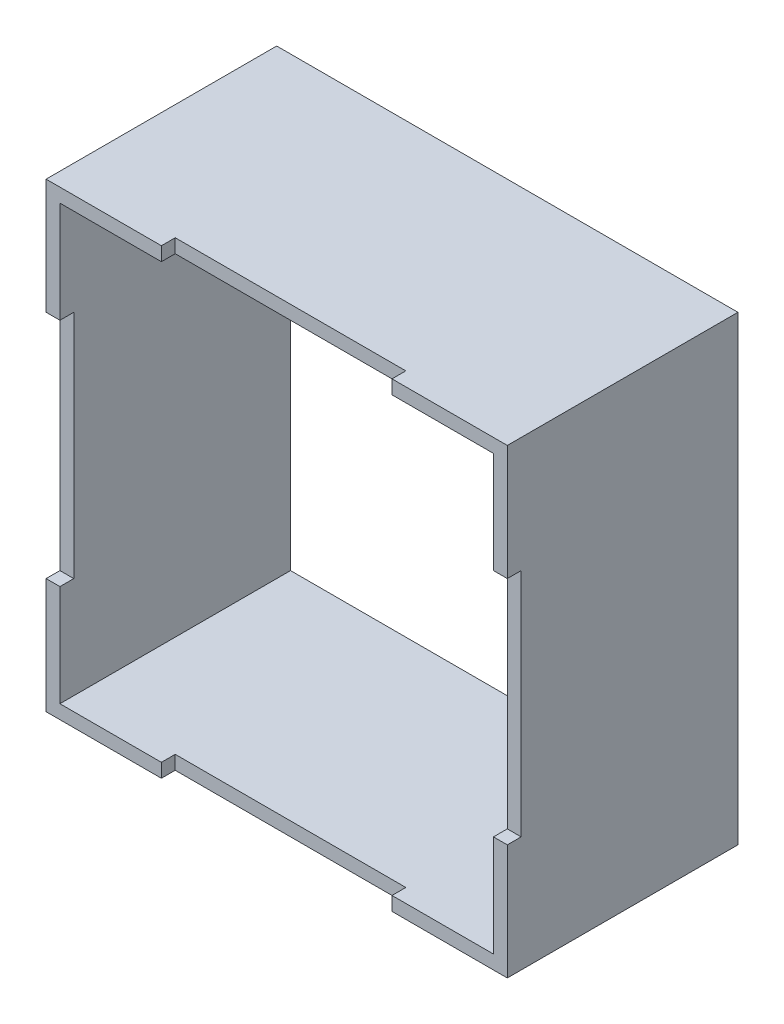
ISO-10303-21;
HEADER;
FILE_DESCRIPTION(('STEP AP214'),'2;1');
FILE_NAME('part.step','',(''),(''),'','','');
FILE_SCHEMA(('AUTOMOTIVE_DESIGN { 1 0 10303 214 1 1 1 1 }'));
ENDSEC;
DATA;
#1=APPLICATION_CONTEXT('core data for automotive mechanical design processes');
#2=APPLICATION_PROTOCOL_DEFINITION('international standard','automotive_design',2000,#1);
#3=PRODUCT_CONTEXT('',#1,'mechanical');
#4=PRODUCT('Part','Part','',(#3));
#5=PRODUCT_RELATED_PRODUCT_CATEGORY('part','',(#4));
#6=PRODUCT_DEFINITION_FORMATION('','',#4);
#7=PRODUCT_DEFINITION_CONTEXT('part definition',#1,'design');
#8=PRODUCT_DEFINITION('design','',#6,#7);
#9=PRODUCT_DEFINITION_SHAPE('','',#8);
#10=(LENGTH_UNIT() NAMED_UNIT(*) SI_UNIT(.MILLI.,.METRE.));
#11=(NAMED_UNIT(*) PLANE_ANGLE_UNIT() SI_UNIT($,.RADIAN.));
#12=(NAMED_UNIT(*) SI_UNIT($,.STERADIAN.) SOLID_ANGLE_UNIT());
#13=UNCERTAINTY_MEASURE_WITH_UNIT(LENGTH_MEASURE(1.E-05),#10,'distance_accuracy_value','');
#14=(GEOMETRIC_REPRESENTATION_CONTEXT(3) GLOBAL_UNCERTAINTY_ASSIGNED_CONTEXT((#13)) GLOBAL_UNIT_ASSIGNED_CONTEXT((#10,
#11,#12)) REPRESENTATION_CONTEXT('',''));
#15=CARTESIAN_POINT('',(0.,0.,0.));
#16=DIRECTION('',(0.,0.,1.));
#17=DIRECTION('',(1.,0.,0.));
#18=AXIS2_PLACEMENT_3D('',#15,#16,#17);
#19=CARTESIAN_POINT('',(0.,0.,50.));
#20=DIRECTION('',(0.,0.,1.));
#21=DIRECTION('',(1.,0.,0.));
#22=AXIS2_PLACEMENT_3D('',#19,#20,#21);
#23=PLANE('',#22);
#24=DIRECTION('',(0.,-1.,0.));
#25=VECTOR('',#24,1.);
#26=CARTESIAN_POINT('',(25.,0.,50.));
#27=LINE('',#26,#25);
#28=CARTESIAN_POINT('',(25.,0.,50.));
#29=VERTEX_POINT('',#28);
#30=CARTESIAN_POINT('',(25.,-3.,50.));
#31=VERTEX_POINT('',#30);
#32=EDGE_CURVE('E229',#29,#31,#27,.T.);
#33=ORIENTED_EDGE('',*,*,#32,.F.);
#34=DIRECTION('',(-1.,0.,0.));
#35=VECTOR('',#34,1.);
#36=CARTESIAN_POINT('',(0.,0.,50.));
#37=LINE('',#36,#35);
#38=CARTESIAN_POINT('',(0.,0.,50.));
#39=VERTEX_POINT('',#38);
#40=EDGE_CURVE('E218',#29,#39,#37,.T.);
#41=ORIENTED_EDGE('',*,*,#40,.T.);
#42=DIRECTION('',(0.,-1.,0.));
#43=VECTOR('',#42,1.);
#44=CARTESIAN_POINT('',(0.,0.,50.));
#45=LINE('',#44,#43);
#46=CARTESIAN_POINT('',(0.,-25.,50.));
#47=VERTEX_POINT('',#46);
#48=EDGE_CURVE('E320',#39,#47,#45,.T.);
#49=ORIENTED_EDGE('',*,*,#48,.T.);
#50=DIRECTION('',(-1.,0.,0.));
#51=VECTOR('',#50,1.);
#52=CARTESIAN_POINT('',(100.,-25.,50.));
#53=LINE('',#52,#51);
#54=CARTESIAN_POINT('',(3.,-25.,50.));
#55=VERTEX_POINT('',#54);
#56=EDGE_CURVE('E264',#55,#47,#53,.T.);
#57=ORIENTED_EDGE('',*,*,#56,.F.);
#58=DIRECTION('',(0.,-1.,0.));
#59=VECTOR('',#58,1.);
#60=CARTESIAN_POINT('',(3.,-3.,50.));
#61=LINE('',#60,#59);
#62=CARTESIAN_POINT('',(3.,-3.,50.));
#63=VERTEX_POINT('',#62);
#64=EDGE_CURVE('E282',#63,#55,#61,.T.);
#65=ORIENTED_EDGE('',*,*,#64,.F.);
#66=DIRECTION('',(-1.,0.,0.));
#67=VECTOR('',#66,1.);
#68=CARTESIAN_POINT('',(3.,-3.,50.));
#69=LINE('',#68,#67);
#70=EDGE_CURVE('E294',#31,#63,#69,.T.);
#71=ORIENTED_EDGE('',*,*,#70,.F.);
#72=EDGE_LOOP('',(#33,#41,#49,#57,#65,#71));
#73=FACE_BOUND('',#72,.T.);
#74=ADVANCED_FACE('F39',(#73),#23,.T.);
#75=CARTESIAN_POINT('',(25.,-97.,50.));
#76=VERTEX_POINT('',#75);
#77=CARTESIAN_POINT('',(25.,-100.,50.));
#78=VERTEX_POINT('',#77);
#79=EDGE_CURVE('E232',#76,#78,#27,.T.);
#80=ORIENTED_EDGE('',*,*,#79,.F.);
#81=DIRECTION('',(1.,0.,0.));
#82=VECTOR('',#81,1.);
#83=CARTESIAN_POINT('',(3.00000000000001,-97.,50.));
#84=LINE('',#83,#82);
#85=CARTESIAN_POINT('',(3.00000000000001,-97.,50.));
#86=VERTEX_POINT('',#85);
#87=EDGE_CURVE('E287',#86,#76,#84,.T.);
#88=ORIENTED_EDGE('',*,*,#87,.F.);
#89=CARTESIAN_POINT('',(3.,-75.,50.));
#90=VERTEX_POINT('',#89);
#91=EDGE_CURVE('E286',#90,#86,#61,.T.);
#92=ORIENTED_EDGE('',*,*,#91,.F.);
#93=DIRECTION('',(-1.,0.,0.));
#94=VECTOR('',#93,1.);
#95=CARTESIAN_POINT('',(100.,-75.,50.));
#96=LINE('',#95,#94);
#97=CARTESIAN_POINT('',(0.,-75.,50.));
#98=VERTEX_POINT('',#97);
#99=EDGE_CURVE('E268',#90,#98,#96,.T.);
#100=ORIENTED_EDGE('',*,*,#99,.T.);
#101=CARTESIAN_POINT('',(0.,-100.,50.));
#102=VERTEX_POINT('',#101);
#103=EDGE_CURVE('E324',#98,#102,#45,.T.);
#104=ORIENTED_EDGE('',*,*,#103,.T.);
#105=DIRECTION('',(1.,0.,0.));
#106=VECTOR('',#105,1.);
#107=CARTESIAN_POINT('',(0.,-100.,50.));
#108=LINE('',#107,#106);
#109=EDGE_CURVE('E325',#102,#78,#108,.T.);
#110=ORIENTED_EDGE('',*,*,#109,.T.);
#111=EDGE_LOOP('',(#80,#88,#92,#100,#104,#110));
#112=FACE_BOUND('',#111,.T.);
#113=ADVANCED_FACE('F440',(#112),#23,.T.);
#114=DIRECTION('',(0.,-1.,0.));
#115=VECTOR('',#114,1.);
#116=CARTESIAN_POINT('',(75.,0.,50.));
#117=LINE('',#116,#115);
#118=CARTESIAN_POINT('',(75.,0.,50.));
#119=VERTEX_POINT('',#118);
#120=CARTESIAN_POINT('',(75.,-3.,50.));
#121=VERTEX_POINT('',#120);
#122=EDGE_CURVE('E233',#119,#121,#117,.T.);
#123=ORIENTED_EDGE('',*,*,#122,.T.);
#124=CARTESIAN_POINT('',(97.,-3.,50.));
#125=VERTEX_POINT('',#124);
#126=EDGE_CURVE('E295',#125,#121,#69,.T.);
#127=ORIENTED_EDGE('',*,*,#126,.F.);
#128=DIRECTION('',(0.,1.,0.));
#129=VECTOR('',#128,1.);
#130=CARTESIAN_POINT('',(97.,-3.,50.));
#131=LINE('',#130,#129);
#132=CARTESIAN_POINT('',(97.,-25.,50.));
#133=VERTEX_POINT('',#132);
#134=EDGE_CURVE('E290',#133,#125,#131,.T.);
#135=ORIENTED_EDGE('',*,*,#134,.F.);
#136=CARTESIAN_POINT('',(100.,-25.,50.));
#137=VERTEX_POINT('',#136);
#138=EDGE_CURVE('E261',#137,#133,#53,.T.);
#139=ORIENTED_EDGE('',*,*,#138,.F.);
#140=DIRECTION('',(0.,1.,0.));
#141=VECTOR('',#140,1.);
#142=CARTESIAN_POINT('',(100.,0.,50.));
#143=LINE('',#142,#141);
#144=CARTESIAN_POINT('',(100.,0.,50.));
#145=VERTEX_POINT('',#144);
#146=EDGE_CURVE('E328',#137,#145,#143,.T.);
#147=ORIENTED_EDGE('',*,*,#146,.T.);
#148=EDGE_CURVE('E332',#145,#119,#37,.T.);
#149=ORIENTED_EDGE('',*,*,#148,.T.);
#150=EDGE_LOOP('',(#123,#127,#135,#139,#147,#149));
#151=FACE_BOUND('',#150,.T.);
#152=ADVANCED_FACE('F369',(#151),#23,.T.);
#153=CARTESIAN_POINT('',(75.,-97.,50.));
#154=VERTEX_POINT('',#153);
#155=CARTESIAN_POINT('',(75.,-100.,50.));
#156=VERTEX_POINT('',#155);
#157=EDGE_CURVE('E236',#154,#156,#117,.T.);
#158=ORIENTED_EDGE('',*,*,#157,.T.);
#159=CARTESIAN_POINT('',(100.,-100.,50.));
#160=VERTEX_POINT('',#159);
#161=EDGE_CURVE('E323',#156,#160,#108,.T.);
#162=ORIENTED_EDGE('',*,*,#161,.T.);
#163=CARTESIAN_POINT('',(100.,-75.,50.));
#164=VERTEX_POINT('',#163);
#165=EDGE_CURVE('E329',#160,#164,#143,.T.);
#166=ORIENTED_EDGE('',*,*,#165,.T.);
#167=CARTESIAN_POINT('',(97.,-75.,50.));
#168=VERTEX_POINT('',#167);
#169=EDGE_CURVE('E265',#164,#168,#96,.T.);
#170=ORIENTED_EDGE('',*,*,#169,.T.);
#171=CARTESIAN_POINT('',(97.,-97.,50.));
#172=VERTEX_POINT('',#171);
#173=EDGE_CURVE('E291',#172,#168,#131,.T.);
#174=ORIENTED_EDGE('',*,*,#173,.F.);
#175=EDGE_CURVE('E285',#154,#172,#84,.T.);
#176=ORIENTED_EDGE('',*,*,#175,.F.);
#177=EDGE_LOOP('',(#158,#162,#166,#170,#174,#176));
#178=FACE_BOUND('',#177,.T.);
#179=ADVANCED_FACE('F418',(#178),#23,.T.);
#180=CARTESIAN_POINT('',(0.,0.,0.));
#181=DIRECTION('',(0.,0.,1.));
#182=DIRECTION('',(1.,0.,0.));
#183=AXIS2_PLACEMENT_3D('',#180,#181,#182);
#184=PLANE('',#183);
#185=DIRECTION('',(0.,-1.,0.));
#186=VECTOR('',#185,1.);
#187=CARTESIAN_POINT('',(0.,0.,0.));
#188=LINE('',#187,#186);
#189=CARTESIAN_POINT('',(0.,0.,0.));
#190=VERTEX_POINT('',#189);
#191=CARTESIAN_POINT('',(0.,-100.,0.));
#192=VERTEX_POINT('',#191);
#193=EDGE_CURVE('E319',#190,#192,#188,.T.);
#194=ORIENTED_EDGE('',*,*,#193,.F.);
#195=DIRECTION('',(-1.,0.,0.));
#196=VECTOR('',#195,1.);
#197=CARTESIAN_POINT('',(0.,0.,0.));
#198=LINE('',#197,#196);
#199=CARTESIAN_POINT('',(100.,0.,0.));
#200=VERTEX_POINT('',#199);
#201=EDGE_CURVE('E342',#200,#190,#198,.T.);
#202=ORIENTED_EDGE('',*,*,#201,.F.);
#203=DIRECTION('',(0.,1.,0.));
#204=VECTOR('',#203,1.);
#205=CARTESIAN_POINT('',(100.,0.,0.));
#206=LINE('',#205,#204);
#207=CARTESIAN_POINT('',(100.,-100.,0.));
#208=VERTEX_POINT('',#207);
#209=EDGE_CURVE('E340',#208,#200,#206,.T.);
#210=ORIENTED_EDGE('',*,*,#209,.F.);
#211=DIRECTION('',(1.,0.,0.));
#212=VECTOR('',#211,1.);
#213=CARTESIAN_POINT('',(0.,-100.,0.));
#214=LINE('',#213,#212);
#215=EDGE_CURVE('E338',#192,#208,#214,.T.);
#216=ORIENTED_EDGE('',*,*,#215,.F.);
#217=EDGE_LOOP('',(#194,#202,#210,#216));
#218=FACE_BOUND('',#217,.T.);
#219=DIRECTION('',(0.,-1.,0.));
#220=VECTOR('',#219,1.);
#221=CARTESIAN_POINT('',(3.,-3.,0.));
#222=LINE('',#221,#220);
#223=CARTESIAN_POINT('',(3.,-3.,0.));
#224=VERTEX_POINT('',#223);
#225=CARTESIAN_POINT('',(3.00000000000001,-97.,0.));
#226=VERTEX_POINT('',#225);
#227=EDGE_CURVE('E281',#224,#226,#222,.T.);
#228=ORIENTED_EDGE('',*,*,#227,.T.);
#229=DIRECTION('',(1.,0.,0.));
#230=VECTOR('',#229,1.);
#231=CARTESIAN_POINT('',(3.00000000000001,-97.,0.));
#232=LINE('',#231,#230);
#233=CARTESIAN_POINT('',(97.,-97.,0.));
#234=VERTEX_POINT('',#233);
#235=EDGE_CURVE('E301',#226,#234,#232,.T.);
#236=ORIENTED_EDGE('',*,*,#235,.T.);
#237=DIRECTION('',(0.,1.,0.));
#238=VECTOR('',#237,1.);
#239=CARTESIAN_POINT('',(97.,-3.,0.));
#240=LINE('',#239,#238);
#241=CARTESIAN_POINT('',(97.,-3.,0.));
#242=VERTEX_POINT('',#241);
#243=EDGE_CURVE('E304',#234,#242,#240,.T.);
#244=ORIENTED_EDGE('',*,*,#243,.T.);
#245=DIRECTION('',(-1.,0.,0.));
#246=VECTOR('',#245,1.);
#247=CARTESIAN_POINT('',(3.,-3.,0.));
#248=LINE('',#247,#246);
#249=EDGE_CURVE('E307',#242,#224,#248,.T.);
#250=ORIENTED_EDGE('',*,*,#249,.T.);
#251=EDGE_LOOP('',(#228,#236,#244,#250));
#252=FACE_BOUND('',#251,.T.);
#253=ADVANCED_FACE('F391',(#218,#252),#184,.F.);
#254=CARTESIAN_POINT('',(0.,0.,50.));
#255=DIRECTION('',(1.,0.,0.));
#256=DIRECTION('',(0.,1.,0.));
#257=AXIS2_PLACEMENT_3D('',#254,#255,#256);
#258=PLANE('',#257);
#259=DIRECTION('',(0.,-1.,0.));
#260=VECTOR('',#259,1.);
#261=CARTESIAN_POINT('',(0.,-75.,47.));
#262=LINE('',#261,#260);
#263=CARTESIAN_POINT('',(0.,-25.,47.));
#264=VERTEX_POINT('',#263);
#265=CARTESIAN_POINT('',(0.,-75.,47.));
#266=VERTEX_POINT('',#265);
#267=EDGE_CURVE('E257',#264,#266,#262,.T.);
#268=ORIENTED_EDGE('',*,*,#267,.F.);
#269=DIRECTION('',(0.,0.,-1.));
#270=VECTOR('',#269,1.);
#271=CARTESIAN_POINT('',(0.,-25.,47.));
#272=LINE('',#271,#270);
#273=EDGE_CURVE('E243',#47,#264,#272,.T.);
#274=ORIENTED_EDGE('',*,*,#273,.F.);
#275=ORIENTED_EDGE('',*,*,#48,.F.);
#276=DIRECTION('',(0.,0.,-1.));
#277=VECTOR('',#276,1.);
#278=CARTESIAN_POINT('',(0.,0.,50.));
#279=LINE('',#278,#277);
#280=EDGE_CURVE('E335',#39,#190,#279,.T.);
#281=ORIENTED_EDGE('',*,*,#280,.T.);
#282=ORIENTED_EDGE('',*,*,#193,.T.);
#283=DIRECTION('',(0.,0.,-1.));
#284=VECTOR('',#283,1.);
#285=CARTESIAN_POINT('',(0.,-100.,50.));
#286=LINE('',#285,#284);
#287=EDGE_CURVE('E352',#102,#192,#286,.T.);
#288=ORIENTED_EDGE('',*,*,#287,.F.);
#289=ORIENTED_EDGE('',*,*,#103,.F.);
#290=DIRECTION('',(0.,0.,1.));
#291=VECTOR('',#290,1.);
#292=CARTESIAN_POINT('',(0.,-75.,50.));
#293=LINE('',#292,#291);
#294=EDGE_CURVE('E248',#266,#98,#293,.T.);
#295=ORIENTED_EDGE('',*,*,#294,.F.);
#296=EDGE_LOOP('',(#268,#274,#275,#281,#282,#288,#289,#295));
#297=FACE_BOUND('',#296,.T.);
#298=ADVANCED_FACE('F41',(#297),#258,.F.);
#299=CARTESIAN_POINT('',(0.,-100.,50.));
#300=DIRECTION('',(0.,1.,0.));
#301=DIRECTION('',(0.,0.,1.));
#302=AXIS2_PLACEMENT_3D('',#299,#300,#301);
#303=PLANE('',#302);
#304=DIRECTION('',(1.,0.,0.));
#305=VECTOR('',#304,1.);
#306=CARTESIAN_POINT('',(75.,-100.,47.));
#307=LINE('',#306,#305);
#308=CARTESIAN_POINT('',(25.,-100.,47.));
#309=VERTEX_POINT('',#308);
#310=CARTESIAN_POINT('',(75.,-100.,47.));
#311=VERTEX_POINT('',#310);
#312=EDGE_CURVE('E221',#309,#311,#307,.T.);
#313=ORIENTED_EDGE('',*,*,#312,.F.);
#314=DIRECTION('',(0.,0.,-1.));
#315=VECTOR('',#314,1.);
#316=CARTESIAN_POINT('',(25.,-100.,47.));
#317=LINE('',#316,#315);
#318=EDGE_CURVE('E225',#78,#309,#317,.T.);
#319=ORIENTED_EDGE('',*,*,#318,.F.);
#320=ORIENTED_EDGE('',*,*,#109,.F.);
#321=ORIENTED_EDGE('',*,*,#287,.T.);
#322=ORIENTED_EDGE('',*,*,#215,.T.);
#323=DIRECTION('',(0.,0.,-1.));
#324=VECTOR('',#323,1.);
#325=CARTESIAN_POINT('',(100.,-100.,50.));
#326=LINE('',#325,#324);
#327=EDGE_CURVE('E349',#160,#208,#326,.T.);
#328=ORIENTED_EDGE('',*,*,#327,.F.);
#329=ORIENTED_EDGE('',*,*,#161,.F.);
#330=DIRECTION('',(0.,0.,1.));
#331=VECTOR('',#330,1.);
#332=CARTESIAN_POINT('',(75.,-100.,50.));
#333=LINE('',#332,#331);
#334=EDGE_CURVE('E219',#311,#156,#333,.T.);
#335=ORIENTED_EDGE('',*,*,#334,.F.);
#336=EDGE_LOOP('',(#313,#319,#320,#321,#322,#328,#329,#335));
#337=FACE_BOUND('',#336,.T.);
#338=ADVANCED_FACE('F535',(#337),#303,.F.);
#339=CARTESIAN_POINT('',(100.,0.,50.));
#340=DIRECTION('',(-1.,0.,0.));
#341=DIRECTION('',(0.,-1.,0.));
#342=AXIS2_PLACEMENT_3D('',#339,#340,#341);
#343=PLANE('',#342);
#344=ORIENTED_EDGE('',*,*,#146,.F.);
#345=DIRECTION('',(0.,0.,-1.));
#346=VECTOR('',#345,1.);
#347=CARTESIAN_POINT('',(100.,-25.,47.));
#348=LINE('',#347,#346);
#349=CARTESIAN_POINT('',(100.,-25.,47.));
#350=VERTEX_POINT('',#349);
#351=EDGE_CURVE('E244',#137,#350,#348,.T.);
#352=ORIENTED_EDGE('',*,*,#351,.T.);
#353=DIRECTION('',(0.,-1.,0.));
#354=VECTOR('',#353,1.);
#355=CARTESIAN_POINT('',(100.,-75.,47.));
#356=LINE('',#355,#354);
#357=CARTESIAN_POINT('',(100.,-75.,47.));
#358=VERTEX_POINT('',#357);
#359=EDGE_CURVE('E247',#350,#358,#356,.T.);
#360=ORIENTED_EDGE('',*,*,#359,.T.);
#361=DIRECTION('',(0.,0.,1.));
#362=VECTOR('',#361,1.);
#363=CARTESIAN_POINT('',(100.,-75.,50.));
#364=LINE('',#363,#362);
#365=EDGE_CURVE('E251',#358,#164,#364,.T.);
#366=ORIENTED_EDGE('',*,*,#365,.T.);
#367=ORIENTED_EDGE('',*,*,#165,.F.);
#368=ORIENTED_EDGE('',*,*,#327,.T.);
#369=ORIENTED_EDGE('',*,*,#209,.T.);
#370=DIRECTION('',(0.,0.,-1.));
#371=VECTOR('',#370,1.);
#372=CARTESIAN_POINT('',(100.,0.,50.));
#373=LINE('',#372,#371);
#374=EDGE_CURVE('E346',#145,#200,#373,.T.);
#375=ORIENTED_EDGE('',*,*,#374,.F.);
#376=EDGE_LOOP('',(#344,#352,#360,#366,#367,#368,#369,#375));
#377=FACE_BOUND('',#376,.T.);
#378=ADVANCED_FACE('F386',(#377),#343,.F.);
#379=CARTESIAN_POINT('',(0.,0.,50.));
#380=DIRECTION('',(0.,-1.,0.));
#381=DIRECTION('',(0.,0.,-1.));
#382=AXIS2_PLACEMENT_3D('',#379,#380,#381);
#383=PLANE('',#382);
#384=ORIENTED_EDGE('',*,*,#40,.F.);
#385=DIRECTION('',(0.,0.,-1.));
#386=VECTOR('',#385,1.);
#387=CARTESIAN_POINT('',(25.,0.,47.));
#388=LINE('',#387,#386);
#389=CARTESIAN_POINT('',(25.,0.,47.));
#390=VERTEX_POINT('',#389);
#391=EDGE_CURVE('E199',#29,#390,#388,.T.);
#392=ORIENTED_EDGE('',*,*,#391,.T.);
#393=DIRECTION('',(1.,0.,0.));
#394=VECTOR('',#393,1.);
#395=CARTESIAN_POINT('',(75.,0.,47.));
#396=LINE('',#395,#394);
#397=CARTESIAN_POINT('',(75.,0.,47.));
#398=VERTEX_POINT('',#397);
#399=EDGE_CURVE('E206',#390,#398,#396,.T.);
#400=ORIENTED_EDGE('',*,*,#399,.T.);
#401=DIRECTION('',(0.,0.,1.));
#402=VECTOR('',#401,1.);
#403=CARTESIAN_POINT('',(75.,0.,50.));
#404=LINE('',#403,#402);
#405=EDGE_CURVE('E213',#398,#119,#404,.T.);
#406=ORIENTED_EDGE('',*,*,#405,.T.);
#407=ORIENTED_EDGE('',*,*,#148,.F.);
#408=ORIENTED_EDGE('',*,*,#374,.T.);
#409=ORIENTED_EDGE('',*,*,#201,.T.);
#410=ORIENTED_EDGE('',*,*,#280,.F.);
#411=EDGE_LOOP('',(#384,#392,#400,#406,#407,#408,#409,#410));
#412=FACE_BOUND('',#411,.T.);
#413=ADVANCED_FACE('F216',(#412),#383,.F.);
#414=CARTESIAN_POINT('',(3.,-3.,50.));
#415=DIRECTION('',(1.,0.,0.));
#416=DIRECTION('',(0.,1.,0.));
#417=AXIS2_PLACEMENT_3D('',#414,#415,#416);
#418=PLANE('',#417);
#419=DIRECTION('',(0.,0.,1.));
#420=VECTOR('',#419,1.);
#421=CARTESIAN_POINT('',(3.,-25.,50.));
#422=LINE('',#421,#420);
#423=CARTESIAN_POINT('',(3.,-25.,47.));
#424=VERTEX_POINT('',#423);
#425=EDGE_CURVE('E279',#424,#55,#422,.T.);
#426=ORIENTED_EDGE('',*,*,#425,.F.);
#427=DIRECTION('',(0.,1.,0.));
#428=VECTOR('',#427,1.);
#429=CARTESIAN_POINT('',(3.,-3.,47.));
#430=LINE('',#429,#428);
#431=CARTESIAN_POINT('',(3.00000000000001,-75.,47.));
#432=VERTEX_POINT('',#431);
#433=EDGE_CURVE('E263',#432,#424,#430,.T.);
#434=ORIENTED_EDGE('',*,*,#433,.F.);
#435=DIRECTION('',(0.,0.,-1.));
#436=VECTOR('',#435,1.);
#437=CARTESIAN_POINT('',(3.00000000000001,-75.,50.0000000000003));
#438=LINE('',#437,#436);
#439=EDGE_CURVE('E276',#90,#432,#438,.T.);
#440=ORIENTED_EDGE('',*,*,#439,.F.);
#441=ORIENTED_EDGE('',*,*,#91,.T.);
#442=DIRECTION('',(0.,0.,-1.));
#443=VECTOR('',#442,1.);
#444=CARTESIAN_POINT('',(3.00000000000001,-97.,50.));
#445=LINE('',#444,#443);
#446=EDGE_CURVE('E316',#86,#226,#445,.T.);
#447=ORIENTED_EDGE('',*,*,#446,.T.);
#448=ORIENTED_EDGE('',*,*,#227,.F.);
#449=DIRECTION('',(0.,0.,-1.));
#450=VECTOR('',#449,1.);
#451=CARTESIAN_POINT('',(3.,-3.,50.));
#452=LINE('',#451,#450);
#453=EDGE_CURVE('E298',#63,#224,#452,.T.);
#454=ORIENTED_EDGE('',*,*,#453,.F.);
#455=ORIENTED_EDGE('',*,*,#64,.T.);
#456=EDGE_LOOP('',(#426,#434,#440,#441,#447,#448,#454,#455));
#457=FACE_BOUND('',#456,.T.);
#458=ADVANCED_FACE('F406',(#457),#418,.T.);
#459=CARTESIAN_POINT('',(3.00000000000001,-97.,50.));
#460=DIRECTION('',(0.,1.,0.));
#461=DIRECTION('',(0.,0.,1.));
#462=AXIS2_PLACEMENT_3D('',#459,#460,#461);
#463=PLANE('',#462);
#464=DIRECTION('',(0.,0.,1.));
#465=VECTOR('',#464,1.);
#466=CARTESIAN_POINT('',(25.,-97.,50.));
#467=LINE('',#466,#465);
#468=CARTESIAN_POINT('',(25.,-97.,47.));
#469=VERTEX_POINT('',#468);
#470=EDGE_CURVE('E241',#469,#76,#467,.T.);
#471=ORIENTED_EDGE('',*,*,#470,.F.);
#472=DIRECTION('',(-1.,0.,0.));
#473=VECTOR('',#472,1.);
#474=CARTESIAN_POINT('',(3.00000000000001,-97.,47.));
#475=LINE('',#474,#473);
#476=CARTESIAN_POINT('',(75.,-97.,47.));
#477=VERTEX_POINT('',#476);
#478=EDGE_CURVE('E231',#477,#469,#475,.T.);
#479=ORIENTED_EDGE('',*,*,#478,.F.);
#480=DIRECTION('',(0.,0.,-1.));
#481=VECTOR('',#480,1.);
#482=CARTESIAN_POINT('',(75.,-97.,50.));
#483=LINE('',#482,#481);
#484=EDGE_CURVE('E239',#154,#477,#483,.T.);
#485=ORIENTED_EDGE('',*,*,#484,.F.);
#486=ORIENTED_EDGE('',*,*,#175,.T.);
#487=DIRECTION('',(0.,0.,-1.));
#488=VECTOR('',#487,1.);
#489=CARTESIAN_POINT('',(97.,-97.,50.));
#490=LINE('',#489,#488);
#491=EDGE_CURVE('E314',#172,#234,#490,.T.);
#492=ORIENTED_EDGE('',*,*,#491,.T.);
#493=ORIENTED_EDGE('',*,*,#235,.F.);
#494=ORIENTED_EDGE('',*,*,#446,.F.);
#495=ORIENTED_EDGE('',*,*,#87,.T.);
#496=EDGE_LOOP('',(#471,#479,#485,#486,#492,#493,#494,#495));
#497=FACE_BOUND('',#496,.T.);
#498=ADVANCED_FACE('F410',(#497),#463,.T.);
#499=CARTESIAN_POINT('',(97.,-3.,50.));
#500=DIRECTION('',(-1.,0.,0.));
#501=DIRECTION('',(0.,-1.,0.));
#502=AXIS2_PLACEMENT_3D('',#499,#500,#501);
#503=PLANE('',#502);
#504=DIRECTION('',(0.,0.,-1.));
#505=VECTOR('',#504,1.);
#506=CARTESIAN_POINT('',(97.,-25.,50.));
#507=LINE('',#506,#505);
#508=CARTESIAN_POINT('',(97.,-25.,47.));
#509=VERTEX_POINT('',#508);
#510=EDGE_CURVE('E359',#133,#509,#507,.T.);
#511=ORIENTED_EDGE('',*,*,#510,.F.);
#512=ORIENTED_EDGE('',*,*,#134,.T.);
#513=DIRECTION('',(0.,0.,-1.));
#514=VECTOR('',#513,1.);
#515=CARTESIAN_POINT('',(97.,-3.,50.));
#516=LINE('',#515,#514);
#517=EDGE_CURVE('E312',#125,#242,#516,.T.);
#518=ORIENTED_EDGE('',*,*,#517,.T.);
#519=ORIENTED_EDGE('',*,*,#243,.F.);
#520=ORIENTED_EDGE('',*,*,#491,.F.);
#521=ORIENTED_EDGE('',*,*,#173,.T.);
#522=DIRECTION('',(0.,0.,1.));
#523=VECTOR('',#522,1.);
#524=CARTESIAN_POINT('',(97.,-75.,50.0000000000003));
#525=LINE('',#524,#523);
#526=CARTESIAN_POINT('',(97.,-75.,47.));
#527=VERTEX_POINT('',#526);
#528=EDGE_CURVE('E357',#527,#168,#525,.T.);
#529=ORIENTED_EDGE('',*,*,#528,.F.);
#530=DIRECTION('',(0.,-1.,0.));
#531=VECTOR('',#530,1.);
#532=CARTESIAN_POINT('',(97.,-3.,47.));
#533=LINE('',#532,#531);
#534=EDGE_CURVE('E355',#509,#527,#533,.T.);
#535=ORIENTED_EDGE('',*,*,#534,.F.);
#536=EDGE_LOOP('',(#511,#512,#518,#519,#520,#521,#529,#535));
#537=FACE_BOUND('',#536,.T.);
#538=ADVANCED_FACE('F378',(#537),#503,.T.);
#539=CARTESIAN_POINT('',(3.,-3.,50.));
#540=DIRECTION('',(0.,-1.,0.));
#541=DIRECTION('',(0.,0.,-1.));
#542=AXIS2_PLACEMENT_3D('',#539,#540,#541);
#543=PLANE('',#542);
#544=DIRECTION('',(0.,0.,-1.));
#545=VECTOR('',#544,1.);
#546=CARTESIAN_POINT('',(25.,-3.,50.));
#547=LINE('',#546,#545);
#548=CARTESIAN_POINT('',(25.,-3.,47.));
#549=VERTEX_POINT('',#548);
#550=EDGE_CURVE('E11',#31,#549,#547,.T.);
#551=ORIENTED_EDGE('',*,*,#550,.F.);
#552=ORIENTED_EDGE('',*,*,#70,.T.);
#553=ORIENTED_EDGE('',*,*,#453,.T.);
#554=ORIENTED_EDGE('',*,*,#249,.F.);
#555=ORIENTED_EDGE('',*,*,#517,.F.);
#556=ORIENTED_EDGE('',*,*,#126,.T.);
#557=DIRECTION('',(0.,0.,1.));
#558=VECTOR('',#557,1.);
#559=CARTESIAN_POINT('',(75.,-3.,50.));
#560=LINE('',#559,#558);
#561=CARTESIAN_POINT('',(75.,-3.,47.));
#562=VERTEX_POINT('',#561);
#563=EDGE_CURVE('E47',#562,#121,#560,.T.);
#564=ORIENTED_EDGE('',*,*,#563,.F.);
#565=DIRECTION('',(1.,0.,0.));
#566=VECTOR('',#565,1.);
#567=CARTESIAN_POINT('',(3.,-3.,47.));
#568=LINE('',#567,#566);
#569=EDGE_CURVE('E362',#549,#562,#568,.T.);
#570=ORIENTED_EDGE('',*,*,#569,.F.);
#571=EDGE_LOOP('',(#551,#552,#553,#554,#555,#556,#564,#570));
#572=FACE_BOUND('',#571,.T.);
#573=ADVANCED_FACE('F373',(#572),#543,.T.);
#574=CARTESIAN_POINT('',(100.,-75.,47.));
#575=DIRECTION('',(0.,0.,-1.));
#576=DIRECTION('',(-1.,0.,0.));
#577=AXIS2_PLACEMENT_3D('',#574,#575,#576);
#578=PLANE('',#577);
#579=ORIENTED_EDGE('',*,*,#534,.T.);
#580=DIRECTION('',(-1.,0.,0.));
#581=VECTOR('',#580,1.);
#582=CARTESIAN_POINT('',(100.,-75.,47.));
#583=LINE('',#582,#581);
#584=EDGE_CURVE('E269',#358,#527,#583,.T.);
#585=ORIENTED_EDGE('',*,*,#584,.F.);
#586=ORIENTED_EDGE('',*,*,#359,.F.);
#587=DIRECTION('',(-1.,0.,0.));
#588=VECTOR('',#587,1.);
#589=CARTESIAN_POINT('',(100.,-25.,47.));
#590=LINE('',#589,#588);
#591=EDGE_CURVE('E273',#350,#509,#590,.T.);
#592=ORIENTED_EDGE('',*,*,#591,.T.);
#593=EDGE_LOOP('',(#579,#585,#586,#592));
#594=FACE_BOUND('',#593,.T.);
#595=ADVANCED_FACE('F425',(#594),#578,.F.);
#596=CARTESIAN_POINT('',(100.,-75.,50.));
#597=DIRECTION('',(0.,-1.,0.));
#598=DIRECTION('',(0.,0.,-1.));
#599=AXIS2_PLACEMENT_3D('',#596,#597,#598);
#600=PLANE('',#599);
#601=ORIENTED_EDGE('',*,*,#528,.T.);
#602=ORIENTED_EDGE('',*,*,#169,.F.);
#603=ORIENTED_EDGE('',*,*,#365,.F.);
#604=ORIENTED_EDGE('',*,*,#584,.T.);
#605=EDGE_LOOP('',(#601,#602,#603,#604));
#606=FACE_BOUND('',#605,.T.);
#607=ADVANCED_FACE('F422',(#606),#600,.F.);
#608=CARTESIAN_POINT('',(100.,-25.,47.));
#609=DIRECTION('',(0.,1.,0.));
#610=DIRECTION('',(-1.,0.,0.));
#611=AXIS2_PLACEMENT_3D('',#608,#609,#610);
#612=PLANE('',#611);
#613=ORIENTED_EDGE('',*,*,#510,.T.);
#614=ORIENTED_EDGE('',*,*,#591,.F.);
#615=ORIENTED_EDGE('',*,*,#351,.F.);
#616=ORIENTED_EDGE('',*,*,#138,.T.);
#617=EDGE_LOOP('',(#613,#614,#615,#616));
#618=FACE_BOUND('',#617,.T.);
#619=ADVANCED_FACE('F426',(#618),#612,.F.);
#620=ORIENTED_EDGE('',*,*,#425,.T.);
#621=ORIENTED_EDGE('',*,*,#56,.T.);
#622=ORIENTED_EDGE('',*,*,#273,.T.);
#623=EDGE_CURVE('E254',#424,#264,#590,.T.);
#624=ORIENTED_EDGE('',*,*,#623,.F.);
#625=EDGE_LOOP('',(#620,#621,#622,#624));
#626=FACE_BOUND('',#625,.T.);
#627=ADVANCED_FACE('F428',(#626),#612,.F.);
#628=ORIENTED_EDGE('',*,*,#439,.T.);
#629=EDGE_CURVE('E272',#432,#266,#583,.T.);
#630=ORIENTED_EDGE('',*,*,#629,.T.);
#631=ORIENTED_EDGE('',*,*,#294,.T.);
#632=ORIENTED_EDGE('',*,*,#99,.F.);
#633=EDGE_LOOP('',(#628,#630,#631,#632));
#634=FACE_BOUND('',#633,.T.);
#635=ADVANCED_FACE('F434',(#634),#600,.F.);
#636=ORIENTED_EDGE('',*,*,#433,.T.);
#637=ORIENTED_EDGE('',*,*,#623,.T.);
#638=ORIENTED_EDGE('',*,*,#267,.T.);
#639=ORIENTED_EDGE('',*,*,#629,.F.);
#640=EDGE_LOOP('',(#636,#637,#638,#639));
#641=FACE_BOUND('',#640,.T.);
#642=ADVANCED_FACE('F470',(#641),#578,.F.);
#643=CARTESIAN_POINT('',(75.,0.,47.));
#644=DIRECTION('',(0.,0.,-1.));
#645=DIRECTION('',(-1.,0.,0.));
#646=AXIS2_PLACEMENT_3D('',#643,#644,#645);
#647=PLANE('',#646);
#648=ORIENTED_EDGE('',*,*,#569,.T.);
#649=DIRECTION('',(0.,-1.,0.));
#650=VECTOR('',#649,1.);
#651=CARTESIAN_POINT('',(75.,0.,47.));
#652=LINE('',#651,#650);
#653=EDGE_CURVE('E209',#398,#562,#652,.T.);
#654=ORIENTED_EDGE('',*,*,#653,.F.);
#655=ORIENTED_EDGE('',*,*,#399,.F.);
#656=DIRECTION('',(0.,-1.,0.));
#657=VECTOR('',#656,1.);
#658=CARTESIAN_POINT('',(25.,0.,47.));
#659=LINE('',#658,#657);
#660=EDGE_CURVE('E62',#390,#549,#659,.T.);
#661=ORIENTED_EDGE('',*,*,#660,.T.);
#662=EDGE_LOOP('',(#648,#654,#655,#661));
#663=FACE_BOUND('',#662,.T.);
#664=ADVANCED_FACE('F207',(#663),#647,.F.);
#665=CARTESIAN_POINT('',(75.,0.,50.));
#666=DIRECTION('',(1.,0.,0.));
#667=DIRECTION('',(0.,0.,-1.));
#668=AXIS2_PLACEMENT_3D('',#665,#666,#667);
#669=PLANE('',#668);
#670=ORIENTED_EDGE('',*,*,#563,.T.);
#671=ORIENTED_EDGE('',*,*,#122,.F.);
#672=ORIENTED_EDGE('',*,*,#405,.F.);
#673=ORIENTED_EDGE('',*,*,#653,.T.);
#674=EDGE_LOOP('',(#670,#671,#672,#673));
#675=FACE_BOUND('',#674,.T.);
#676=ADVANCED_FACE('F365',(#675),#669,.F.);
#677=CARTESIAN_POINT('',(25.,0.,47.));
#678=DIRECTION('',(-1.,0.,0.));
#679=DIRECTION('',(0.,0.,1.));
#680=AXIS2_PLACEMENT_3D('',#677,#678,#679);
#681=PLANE('',#680);
#682=ORIENTED_EDGE('',*,*,#550,.T.);
#683=ORIENTED_EDGE('',*,*,#660,.F.);
#684=ORIENTED_EDGE('',*,*,#391,.F.);
#685=ORIENTED_EDGE('',*,*,#32,.T.);
#686=EDGE_LOOP('',(#682,#683,#684,#685));
#687=FACE_BOUND('',#686,.T.);
#688=ADVANCED_FACE('F197',(#687),#681,.F.);
#689=ORIENTED_EDGE('',*,*,#470,.T.);
#690=ORIENTED_EDGE('',*,*,#79,.T.);
#691=ORIENTED_EDGE('',*,*,#318,.T.);
#692=EDGE_CURVE('E203',#469,#309,#659,.T.);
#693=ORIENTED_EDGE('',*,*,#692,.F.);
#694=EDGE_LOOP('',(#689,#690,#691,#693));
#695=FACE_BOUND('',#694,.T.);
#696=ADVANCED_FACE('F602',(#695),#681,.F.);
#697=ORIENTED_EDGE('',*,*,#484,.T.);
#698=EDGE_CURVE('E54',#477,#311,#652,.T.);
#699=ORIENTED_EDGE('',*,*,#698,.T.);
#700=ORIENTED_EDGE('',*,*,#334,.T.);
#701=ORIENTED_EDGE('',*,*,#157,.F.);
#702=EDGE_LOOP('',(#697,#699,#700,#701));
#703=FACE_BOUND('',#702,.T.);
#704=ADVANCED_FACE('F594',(#703),#669,.F.);
#705=ORIENTED_EDGE('',*,*,#478,.T.);
#706=ORIENTED_EDGE('',*,*,#692,.T.);
#707=ORIENTED_EDGE('',*,*,#312,.T.);
#708=ORIENTED_EDGE('',*,*,#698,.F.);
#709=EDGE_LOOP('',(#705,#706,#707,#708));
#710=FACE_BOUND('',#709,.T.);
#711=ADVANCED_FACE('F585',(#710),#647,.F.);
#712=CLOSED_SHELL('',(#74,#113,#152,#179,#253,#298,#338,#378,#413,#458,#498,#538,#573,#595,#607,
#619,#627,#635,#642,#664,#676,#688,#696,#704,#711));
#713=MANIFOLD_SOLID_BREP('B2',#712);
#714=ADVANCED_BREP_SHAPE_REPRESENTATION('',(#18,#713),#14);
#715=SHAPE_DEFINITION_REPRESENTATION(#9,#714);
ENDSEC;
END-ISO-10303-21;
